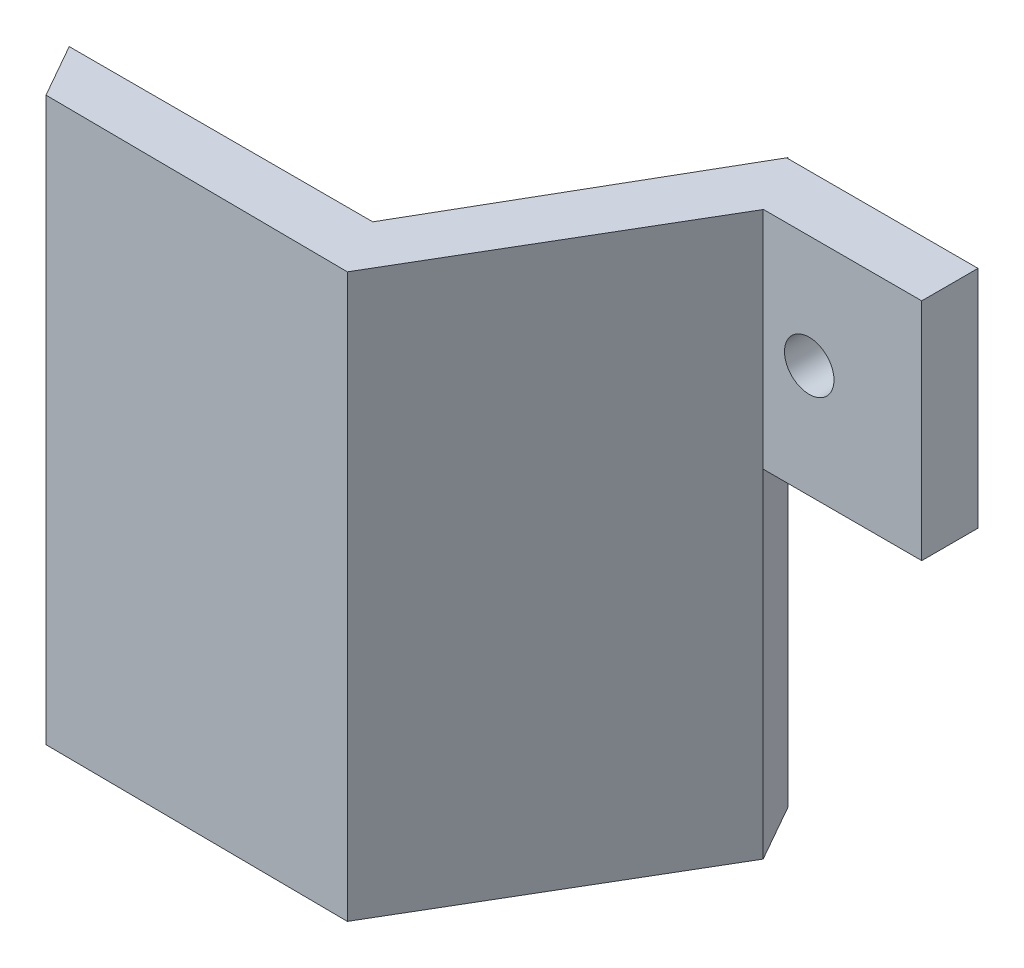
ISO-10303-21;
HEADER;
FILE_DESCRIPTION(('STEP AP214'),'2;1');
FILE_NAME('part.step','',(''),(''),'','','');
FILE_SCHEMA(('AUTOMOTIVE_DESIGN { 1 0 10303 214 1 1 1 1 }'));
ENDSEC;
DATA;
#1=APPLICATION_CONTEXT('core data for automotive mechanical design processes');
#2=APPLICATION_PROTOCOL_DEFINITION('international standard','automotive_design',2000,#1);
#3=PRODUCT_CONTEXT('',#1,'mechanical');
#4=PRODUCT('Part','Part','',(#3));
#5=PRODUCT_RELATED_PRODUCT_CATEGORY('part','',(#4));
#6=PRODUCT_DEFINITION_FORMATION('','',#4);
#7=PRODUCT_DEFINITION_CONTEXT('part definition',#1,'design');
#8=PRODUCT_DEFINITION('design','',#6,#7);
#9=PRODUCT_DEFINITION_SHAPE('','',#8);
#10=(LENGTH_UNIT() NAMED_UNIT(*) SI_UNIT(.MILLI.,.METRE.));
#11=(NAMED_UNIT(*) PLANE_ANGLE_UNIT() SI_UNIT($,.RADIAN.));
#12=(NAMED_UNIT(*) SI_UNIT($,.STERADIAN.) SOLID_ANGLE_UNIT());
#13=UNCERTAINTY_MEASURE_WITH_UNIT(LENGTH_MEASURE(1.E-05),#10,'distance_accuracy_value','');
#14=(GEOMETRIC_REPRESENTATION_CONTEXT(3) GLOBAL_UNCERTAINTY_ASSIGNED_CONTEXT((#13)) GLOBAL_UNIT_ASSIGNED_CONTEXT((#10,
#11,#12)) REPRESENTATION_CONTEXT('',''));
#15=CARTESIAN_POINT('',(0.,0.,0.));
#16=DIRECTION('',(0.,0.,1.));
#17=DIRECTION('',(1.,0.,0.));
#18=AXIS2_PLACEMENT_3D('',#15,#16,#17);
#19=CARTESIAN_POINT('',(-43.9196872769033,-41.552723646265,28.0821653372302));
#20=DIRECTION('',(-0.00782443771191292,0.,0.999969388618718));
#21=DIRECTION('',(0.999969388618718,0.,0.00782443771191292));
#22=AXIS2_PLACEMENT_3D('',#19,#20,#21);
#23=PLANE('',#22);
#24=DIRECTION('',(0.999969388618718,0.,0.00782443771191292));
#25=VECTOR('',#24,1.);
#26=CARTESIAN_POINT('',(-43.9196872769033,8.44727635373507,28.0821653372302));
#27=LINE('',#26,#25);
#28=CARTESIAN_POINT('',(-43.9196872769033,8.44727635373507,28.0821653372303));
#29=VERTEX_POINT('',#28);
#30=CARTESIAN_POINT('',(-16.9237466277084,8.44727635373507,28.2933998594949));
#31=VERTEX_POINT('',#30);
#32=EDGE_CURVE('E151',#29,#31,#27,.T.);
#33=ORIENTED_EDGE('',*,*,#32,.F.);
#34=DIRECTION('',(0.,1.,0.));
#35=VECTOR('',#34,1.);
#36=CARTESIAN_POINT('',(-43.9196872769033,-41.552723646265,28.0821653372302));
#37=LINE('',#36,#35);
#38=CARTESIAN_POINT('',(-43.9196872769033,-41.552723646265,28.0821653372302));
#39=VERTEX_POINT('',#38);
#40=EDGE_CURVE('E112',#39,#29,#37,.T.);
#41=ORIENTED_EDGE('',*,*,#40,.F.);
#42=DIRECTION('',(0.999969388618718,0.,0.00782443771191292));
#43=VECTOR('',#42,1.);
#44=CARTESIAN_POINT('',(-43.9196872769033,-41.552723646265,28.0821653372302));
#45=LINE('',#44,#43);
#46=CARTESIAN_POINT('',(-16.9237466277084,-41.552723646265,28.2933998594949));
#47=VERTEX_POINT('',#46);
#48=EDGE_CURVE('E130',#39,#47,#45,.T.);
#49=ORIENTED_EDGE('',*,*,#48,.T.);
#50=DIRECTION('',(0.,1.,0.));
#51=VECTOR('',#50,1.);
#52=CARTESIAN_POINT('',(-16.9237466277084,-41.552723646265,28.2933998594949));
#53=LINE('',#52,#51);
#54=EDGE_CURVE('E113',#47,#31,#53,.T.);
#55=ORIENTED_EDGE('',*,*,#54,.T.);
#56=EDGE_LOOP('',(#33,#41,#49,#55));
#57=FACE_BOUND('',#56,.T.);
#58=ADVANCED_FACE('F33',(#57),#23,.T.);
#59=CARTESIAN_POINT('',(-57.2347231390634,-41.552723646265,4.59737767483812));
#60=DIRECTION('',(-0.86991111240656,0.,0.493208532480514));
#61=DIRECTION('',(0.493208532480514,0.,0.86991111240656));
#62=AXIS2_PLACEMENT_3D('',#59,#60,#61);
#63=PLANE('',#62);
#64=DIRECTION('',(0.493208532480514,0.,0.86991111240656));
#65=VECTOR('',#64,1.);
#66=CARTESIAN_POINT('',(-57.2347231390634,8.44727635373507,4.59737767483812));
#67=LINE('',#66,#65);
#68=CARTESIAN_POINT('',(-46.6225669577256,8.44727635373507,23.3148814907406));
#69=VERTEX_POINT('',#68);
#70=EDGE_CURVE('E154',#69,#29,#67,.T.);
#71=ORIENTED_EDGE('',*,*,#70,.F.);
#72=DIRECTION('',(0.,1.,0.));
#73=VECTOR('',#72,1.);
#74=CARTESIAN_POINT('',(-46.6225669577256,-41.552723646265,23.3148814907406));
#75=LINE('',#74,#73);
#76=CARTESIAN_POINT('',(-46.6225669577256,-41.552723646265,23.3148814907406));
#77=VERTEX_POINT('',#76);
#78=EDGE_CURVE('E139',#77,#69,#75,.T.);
#79=ORIENTED_EDGE('',*,*,#78,.F.);
#80=DIRECTION('',(0.493208532480513,0.,0.86991111240656));
#81=VECTOR('',#80,1.);
#82=CARTESIAN_POINT('',(-57.2347231390634,-41.552723646265,4.59737767483812));
#83=LINE('',#82,#81);
#84=EDGE_CURVE('E117',#77,#39,#83,.T.);
#85=ORIENTED_EDGE('',*,*,#84,.T.);
#86=ORIENTED_EDGE('',*,*,#40,.T.);
#87=EDGE_LOOP('',(#71,#79,#85,#86));
#88=FACE_BOUND('',#87,.T.);
#89=ADVANCED_FACE('F219',(#88),#63,.T.);
#90=CARTESIAN_POINT('',(-3.24284184067345,-41.552723646265,5.01984671936735));
#91=DIRECTION('',(0.86991111240656,0.,-0.493208532480514));
#92=DIRECTION('',(-0.493208532480514,0.,-0.86991111240656));
#93=AXIS2_PLACEMENT_3D('',#90,#91,#92);
#94=PLANE('',#93);
#95=DIRECTION('',(-0.493208532480514,0.,-0.86991111240656));
#96=VECTOR('',#95,1.);
#97=CARTESIAN_POINT('',(-3.24284184067345,8.44727635373507,5.01984671936735));
#98=LINE('',#97,#96);
#99=CARTESIAN_POINT('',(-3.24284184067345,8.44727635373507,5.01984671936735));
#100=VERTEX_POINT('',#99);
#101=CARTESIAN_POINT('',(-3.25409422174333,8.44727635373507,5.));
#102=VERTEX_POINT('',#101);
#103=EDGE_CURVE('E157',#100,#102,#98,.T.);
#104=ORIENTED_EDGE('',*,*,#103,.F.);
#105=DIRECTION('',(0.,1.,0.));
#106=VECTOR('',#105,1.);
#107=CARTESIAN_POINT('',(-3.24284184067345,-41.552723646265,5.01984671936735));
#108=LINE('',#107,#106);
#109=CARTESIAN_POINT('',(-3.24284184067345,-41.552723646265,5.01984671936735));
#110=VERTEX_POINT('',#109);
#111=EDGE_CURVE('E116',#110,#100,#108,.T.);
#112=ORIENTED_EDGE('',*,*,#111,.F.);
#113=DIRECTION('',(-0.493208532480514,0.,-0.86991111240656));
#114=VECTOR('',#113,1.);
#115=CARTESIAN_POINT('',(-3.24284184067345,-41.552723646265,5.01984671936735));
#116=LINE('',#115,#114);
#117=CARTESIAN_POINT('',(-6.13512985722956,-41.552723646265,-0.0815116720386173));
#118=VERTEX_POINT('',#117);
#119=EDGE_CURVE('E124',#110,#118,#116,.T.);
#120=ORIENTED_EDGE('',*,*,#119,.T.);
#121=DIRECTION('',(0.,-1.,0.));
#122=VECTOR('',#121,1.);
#123=CARTESIAN_POINT('',(-6.13512985722957,-41.552723646265,-0.0815116720386194));
#124=LINE('',#123,#122);
#125=CARTESIAN_POINT('',(-6.13512985722957,8.44727635373507,-0.0815116720386151));
#126=VERTEX_POINT('',#125);
#127=EDGE_CURVE('E133',#126,#118,#124,.T.);
#128=ORIENTED_EDGE('',*,*,#127,.F.);
#129=CARTESIAN_POINT('',(-6.08891565031481,8.44727635373507,0.));
#130=VERTEX_POINT('',#129);
#131=EDGE_CURVE('E158',#130,#126,#98,.T.);
#132=ORIENTED_EDGE('',*,*,#131,.F.);
#133=DIRECTION('',(0.,1.,0.));
#134=VECTOR('',#133,1.);
#135=CARTESIAN_POINT('',(-6.08891565031481,0.,0.));
#136=LINE('',#135,#134);
#137=CARTESIAN_POINT('',(-6.08891565031481,-11.5527236462649,0.));
#138=VERTEX_POINT('',#137);
#139=EDGE_CURVE('E41',#138,#130,#136,.T.);
#140=ORIENTED_EDGE('',*,*,#139,.F.);
#141=DIRECTION('',(-0.493208532480514,0.,-0.86991111240656));
#142=VECTOR('',#141,1.);
#143=CARTESIAN_POINT('',(-4.6923425669488,-11.5527236462649,2.46324701318096));
#144=LINE('',#143,#142);
#145=CARTESIAN_POINT('',(-3.25409422174333,-11.5527236462649,5.));
#146=VERTEX_POINT('',#145);
#147=EDGE_CURVE('E109',#146,#138,#144,.T.);
#148=ORIENTED_EDGE('',*,*,#147,.F.);
#149=DIRECTION('',(0.,1.,0.));
#150=VECTOR('',#149,1.);
#151=CARTESIAN_POINT('',(-3.25409422174333,0.,5.));
#152=LINE('',#151,#150);
#153=EDGE_CURVE('E104',#146,#102,#152,.T.);
#154=ORIENTED_EDGE('',*,*,#153,.T.);
#155=EDGE_LOOP('',(#104,#112,#120,#128,#132,#140,#148,#154));
#156=FACE_BOUND('',#155,.T.);
#157=ADVANCED_FACE('F171',(#156),#94,.T.);
#158=CARTESIAN_POINT('',(-16.9237466277084,-41.552723646265,28.2933998594949));
#159=DIRECTION('',(0.862086674694647,0.,0.506760856138204));
#160=DIRECTION('',(0.506760856138204,0.,-0.862086674694647));
#161=AXIS2_PLACEMENT_3D('',#158,#159,#160);
#162=PLANE('',#161);
#163=DIRECTION('',(0.506760856138204,0.,-0.862086674694647));
#164=VECTOR('',#163,1.);
#165=CARTESIAN_POINT('',(-16.9237466277084,8.44727635373507,28.2933998594949));
#166=LINE('',#165,#164);
#167=EDGE_CURVE('E148',#31,#100,#166,.T.);
#168=ORIENTED_EDGE('',*,*,#167,.F.);
#169=ORIENTED_EDGE('',*,*,#54,.F.);
#170=DIRECTION('',(0.506760856138204,0.,-0.862086674694647));
#171=VECTOR('',#170,1.);
#172=CARTESIAN_POINT('',(-16.9237466277084,-41.552723646265,28.2933998594949));
#173=LINE('',#172,#171);
#174=EDGE_CURVE('E127',#47,#110,#173,.T.);
#175=ORIENTED_EDGE('',*,*,#174,.T.);
#176=ORIENTED_EDGE('',*,*,#111,.T.);
#177=EDGE_LOOP('',(#168,#169,#175,#176));
#178=FACE_BOUND('',#177,.T.);
#179=ADVANCED_FACE('F187',(#178),#162,.T.);
#180=CARTESIAN_POINT('',(0.,-41.552723646265,0.));
#181=DIRECTION('',(0.,1.,0.));
#182=DIRECTION('',(0.,0.,1.));
#183=AXIS2_PLACEMENT_3D('',#180,#181,#182);
#184=PLANE('',#183);
#185=DIRECTION('',(1.,0.,0.));
#186=VECTOR('',#185,1.);
#187=CARTESIAN_POINT('',(0.,-41.552723646265,23.3148814907406));
#188=LINE('',#187,#186);
#189=CARTESIAN_POINT('',(-19.6430437478265,-41.552723646265,23.3148814907406));
#190=VERTEX_POINT('',#189);
#191=EDGE_CURVE('E142',#77,#190,#188,.T.);
#192=ORIENTED_EDGE('',*,*,#191,.T.);
#193=DIRECTION('',(0.5,0.,-0.866025403784439));
#194=VECTOR('',#193,1.);
#195=CARTESIAN_POINT('',(-4.63664298226737,-41.552723646265,-2.67696707394825));
#196=LINE('',#195,#194);
#197=EDGE_CURVE('E136',#190,#118,#196,.T.);
#198=ORIENTED_EDGE('',*,*,#197,.T.);
#199=ORIENTED_EDGE('',*,*,#119,.F.);
#200=ORIENTED_EDGE('',*,*,#174,.F.);
#201=ORIENTED_EDGE('',*,*,#48,.F.);
#202=ORIENTED_EDGE('',*,*,#84,.F.);
#203=EDGE_LOOP('',(#192,#198,#199,#200,#201,#202));
#204=FACE_BOUND('',#203,.T.);
#205=ADVANCED_FACE('F180',(#204),#184,.F.);
#206=CARTESIAN_POINT('',(-9.16661555157443,-11.5527236462649,5.));
#207=DIRECTION('',(0.,1.,0.));
#208=DIRECTION('',(0.,0.,1.));
#209=AXIS2_PLACEMENT_3D('',#206,#207,#208);
#210=PLANE('',#209);
#211=DIRECTION('',(1.,0.,0.));
#212=VECTOR('',#211,1.);
#213=CARTESIAN_POINT('',(-9.16661555157443,-11.5527236462649,5.));
#214=LINE('',#213,#212);
#215=CARTESIAN_POINT('',(10.8333844484256,-11.5527236462649,5.));
#216=VERTEX_POINT('',#215);
#217=EDGE_CURVE('E92',#146,#216,#214,.T.);
#218=ORIENTED_EDGE('',*,*,#217,.F.);
#219=ORIENTED_EDGE('',*,*,#147,.T.);
#220=DIRECTION('',(1.,0.,0.));
#221=VECTOR('',#220,1.);
#222=CARTESIAN_POINT('',(-9.16661555157443,-11.5527236462649,0.));
#223=LINE('',#222,#221);
#224=CARTESIAN_POINT('',(10.8333844484256,-11.5527236462649,0.));
#225=VERTEX_POINT('',#224);
#226=EDGE_CURVE('E80',#138,#225,#223,.T.);
#227=ORIENTED_EDGE('',*,*,#226,.T.);
#228=DIRECTION('',(0.,0.,-1.));
#229=VECTOR('',#228,1.);
#230=CARTESIAN_POINT('',(10.8333844484256,-11.5527236462649,5.));
#231=LINE('',#230,#229);
#232=EDGE_CURVE('E75',#216,#225,#231,.T.);
#233=ORIENTED_EDGE('',*,*,#232,.F.);
#234=EDGE_LOOP('',(#218,#219,#227,#233));
#235=FACE_BOUND('',#234,.T.);
#236=ADVANCED_FACE('F35',(#235),#210,.F.);
#237=CARTESIAN_POINT('',(10.8333844484256,8.44727635373506,5.));
#238=DIRECTION('',(-1.,0.,0.));
#239=DIRECTION('',(0.,-1.,0.));
#240=AXIS2_PLACEMENT_3D('',#237,#238,#239);
#241=PLANE('',#240);
#242=DIRECTION('',(0.,1.,0.));
#243=VECTOR('',#242,1.);
#244=CARTESIAN_POINT('',(10.8333844484256,8.44727635373506,0.));
#245=LINE('',#244,#243);
#246=CARTESIAN_POINT('',(10.8333844484256,8.44727635373506,0.));
#247=VERTEX_POINT('',#246);
#248=EDGE_CURVE('E69',#225,#247,#245,.T.);
#249=ORIENTED_EDGE('',*,*,#248,.T.);
#250=DIRECTION('',(0.,0.,-1.));
#251=VECTOR('',#250,1.);
#252=CARTESIAN_POINT('',(10.8333844484256,8.44727635373506,5.));
#253=LINE('',#252,#251);
#254=CARTESIAN_POINT('',(10.8333844484256,8.44727635373506,5.));
#255=VERTEX_POINT('',#254);
#256=EDGE_CURVE('E72',#255,#247,#253,.T.);
#257=ORIENTED_EDGE('',*,*,#256,.F.);
#258=DIRECTION('',(0.,1.,0.));
#259=VECTOR('',#258,1.);
#260=CARTESIAN_POINT('',(10.8333844484256,8.44727635373506,5.));
#261=LINE('',#260,#259);
#262=EDGE_CURVE('E56',#216,#255,#261,.T.);
#263=ORIENTED_EDGE('',*,*,#262,.F.);
#264=ORIENTED_EDGE('',*,*,#232,.T.);
#265=EDGE_LOOP('',(#249,#257,#263,#264));
#266=FACE_BOUND('',#265,.T.);
#267=ADVANCED_FACE('F71',(#266),#241,.F.);
#268=CARTESIAN_POINT('',(-9.16661555157443,8.44727635373506,5.));
#269=DIRECTION('',(0.,-1.,0.));
#270=DIRECTION('',(0.,0.,-1.));
#271=AXIS2_PLACEMENT_3D('',#268,#269,#270);
#272=PLANE('',#271);
#273=DIRECTION('',(-1.,0.,0.));
#274=VECTOR('',#273,1.);
#275=CARTESIAN_POINT('',(-9.16661555157443,8.44727635373506,0.));
#276=LINE('',#275,#274);
#277=EDGE_CURVE('E79',#247,#130,#276,.T.);
#278=ORIENTED_EDGE('',*,*,#277,.T.);
#279=ORIENTED_EDGE('',*,*,#131,.T.);
#280=DIRECTION('',(0.5,0.,-0.866025403784439));
#281=VECTOR('',#280,1.);
#282=CARTESIAN_POINT('',(-19.6430437478265,8.44727635373507,23.3148814907406));
#283=LINE('',#282,#281);
#284=CARTESIAN_POINT('',(-19.6430437478265,8.44727635373507,23.3148814907406));
#285=VERTEX_POINT('',#284);
#286=EDGE_CURVE('E48',#285,#126,#283,.T.);
#287=ORIENTED_EDGE('',*,*,#286,.F.);
#288=DIRECTION('',(1.,0.,0.));
#289=VECTOR('',#288,1.);
#290=CARTESIAN_POINT('',(-50.9857347313559,8.44727635373507,23.3148814907406));
#291=LINE('',#290,#289);
#292=EDGE_CURVE('E11',#69,#285,#291,.T.);
#293=ORIENTED_EDGE('',*,*,#292,.F.);
#294=ORIENTED_EDGE('',*,*,#70,.T.);
#295=ORIENTED_EDGE('',*,*,#32,.T.);
#296=ORIENTED_EDGE('',*,*,#167,.T.);
#297=ORIENTED_EDGE('',*,*,#103,.T.);
#298=DIRECTION('',(-1.,0.,0.));
#299=VECTOR('',#298,1.);
#300=CARTESIAN_POINT('',(-9.16661555157443,8.44727635373506,5.));
#301=LINE('',#300,#299);
#302=EDGE_CURVE('E87',#255,#102,#301,.T.);
#303=ORIENTED_EDGE('',*,*,#302,.F.);
#304=ORIENTED_EDGE('',*,*,#256,.T.);
#305=EDGE_LOOP('',(#278,#279,#287,#293,#294,#295,#296,#297,#303,#304));
#306=FACE_BOUND('',#305,.T.);
#307=ADVANCED_FACE('F83',(#306),#272,.F.);
#308=CARTESIAN_POINT('',(0.,0.,5.));
#309=DIRECTION('',(0.,0.,1.));
#310=DIRECTION('',(1.,0.,0.));
#311=AXIS2_PLACEMENT_3D('',#308,#309,#310);
#312=PLANE('',#311);
#313=ORIENTED_EDGE('',*,*,#153,.F.);
#314=ORIENTED_EDGE('',*,*,#217,.T.);
#315=ORIENTED_EDGE('',*,*,#262,.T.);
#316=ORIENTED_EDGE('',*,*,#302,.T.);
#317=EDGE_LOOP('',(#313,#314,#315,#316));
#318=FACE_BOUND('',#317,.T.);
#319=CARTESIAN_POINT('',(0.833384448425567,-1.55272364626494,5.));
#320=DIRECTION('',(0.,0.,1.));
#321=DIRECTION('',(1.,0.,0.));
#322=AXIS2_PLACEMENT_3D('',#319,#320,#321);
#323=CIRCLE('',#322,2.2);
#324=CARTESIAN_POINT('',(3.03338444842557,-1.55272364626494,5.));
#325=VERTEX_POINT('',#324);
#326=EDGE_CURVE('E101',#325,#325,#323,.T.);
#327=ORIENTED_EDGE('',*,*,#326,.F.);
#328=EDGE_LOOP('',(#327));
#329=FACE_BOUND('',#328,.T.);
#330=ADVANCED_FACE('F210',(#318,#329),#312,.T.);
#331=CARTESIAN_POINT('',(0.,0.,0.));
#332=DIRECTION('',(0.,0.,1.));
#333=DIRECTION('',(1.,0.,0.));
#334=AXIS2_PLACEMENT_3D('',#331,#332,#333);
#335=PLANE('',#334);
#336=CARTESIAN_POINT('',(0.833384448425567,-1.55272364626494,0.));
#337=DIRECTION('',(0.,0.,1.));
#338=DIRECTION('',(1.,0.,0.));
#339=AXIS2_PLACEMENT_3D('',#336,#337,#338);
#340=CIRCLE('',#339,2.2);
#341=CARTESIAN_POINT('',(3.03338444842557,-1.55272364626494,0.));
#342=VERTEX_POINT('',#341);
#343=EDGE_CURVE('E98',#342,#342,#340,.T.);
#344=ORIENTED_EDGE('',*,*,#343,.T.);
#345=EDGE_LOOP('',(#344));
#346=FACE_BOUND('',#345,.T.);
#347=ORIENTED_EDGE('',*,*,#226,.F.);
#348=ORIENTED_EDGE('',*,*,#139,.T.);
#349=ORIENTED_EDGE('',*,*,#277,.F.);
#350=ORIENTED_EDGE('',*,*,#248,.F.);
#351=EDGE_LOOP('',(#347,#348,#349,#350));
#352=FACE_BOUND('',#351,.T.);
#353=ADVANCED_FACE('F90',(#346,#352),#335,.F.);
#354=CARTESIAN_POINT('',(0.833384448425567,-1.55272364626494,0.));
#355=DIRECTION('',(0.,0.,1.));
#356=DIRECTION('',(1.,0.,0.));
#357=AXIS2_PLACEMENT_3D('',#354,#355,#356);
#358=CYLINDRICAL_SURFACE('',#357,2.2);
#359=ORIENTED_EDGE('',*,*,#343,.F.);
#360=EDGE_LOOP('',(#359));
#361=FACE_BOUND('',#360,.T.);
#362=ORIENTED_EDGE('',*,*,#326,.T.);
#363=EDGE_LOOP('',(#362));
#364=FACE_BOUND('',#363,.T.);
#365=ADVANCED_FACE('F229',(#361,#364),#358,.F.);
#366=CARTESIAN_POINT('',(-19.6430437478265,-42.552723646265,23.3148814907406));
#367=DIRECTION('',(0.866025403784439,0.,0.5));
#368=DIRECTION('',(0.5,0.,-0.866025403784439));
#369=AXIS2_PLACEMENT_3D('',#366,#367,#368);
#370=PLANE('',#369);
#371=DIRECTION('',(0.,1.,0.));
#372=VECTOR('',#371,1.);
#373=CARTESIAN_POINT('',(-19.6430437478265,-42.552723646265,23.3148814907406));
#374=LINE('',#373,#372);
#375=EDGE_CURVE('E145',#190,#285,#374,.T.);
#376=ORIENTED_EDGE('',*,*,#375,.T.);
#377=ORIENTED_EDGE('',*,*,#286,.T.);
#378=ORIENTED_EDGE('',*,*,#127,.T.);
#379=ORIENTED_EDGE('',*,*,#197,.F.);
#380=EDGE_LOOP('',(#376,#377,#378,#379));
#381=FACE_BOUND('',#380,.T.);
#382=ADVANCED_FACE('F163',(#381),#370,.F.);
#383=CARTESIAN_POINT('',(-50.9857347313559,-42.552723646265,23.3148814907406));
#384=DIRECTION('',(0.,0.,1.));
#385=DIRECTION('',(1.,0.,0.));
#386=AXIS2_PLACEMENT_3D('',#383,#384,#385);
#387=PLANE('',#386);
#388=ORIENTED_EDGE('',*,*,#78,.T.);
#389=ORIENTED_EDGE('',*,*,#292,.T.);
#390=ORIENTED_EDGE('',*,*,#375,.F.);
#391=ORIENTED_EDGE('',*,*,#191,.F.);
#392=EDGE_LOOP('',(#388,#389,#390,#391));
#393=FACE_BOUND('',#392,.T.);
#394=ADVANCED_FACE('F262',(#393),#387,.F.);
#395=CLOSED_SHELL('',(#58,#89,#157,#179,#205,#236,#267,#307,#330,#353,#365,#382,#394));
#396=MANIFOLD_SOLID_BREP('B2',#395);
#397=ADVANCED_BREP_SHAPE_REPRESENTATION('',(#18,#396),#14);
#398=SHAPE_DEFINITION_REPRESENTATION(#9,#397);
ENDSEC;
END-ISO-10303-21;
